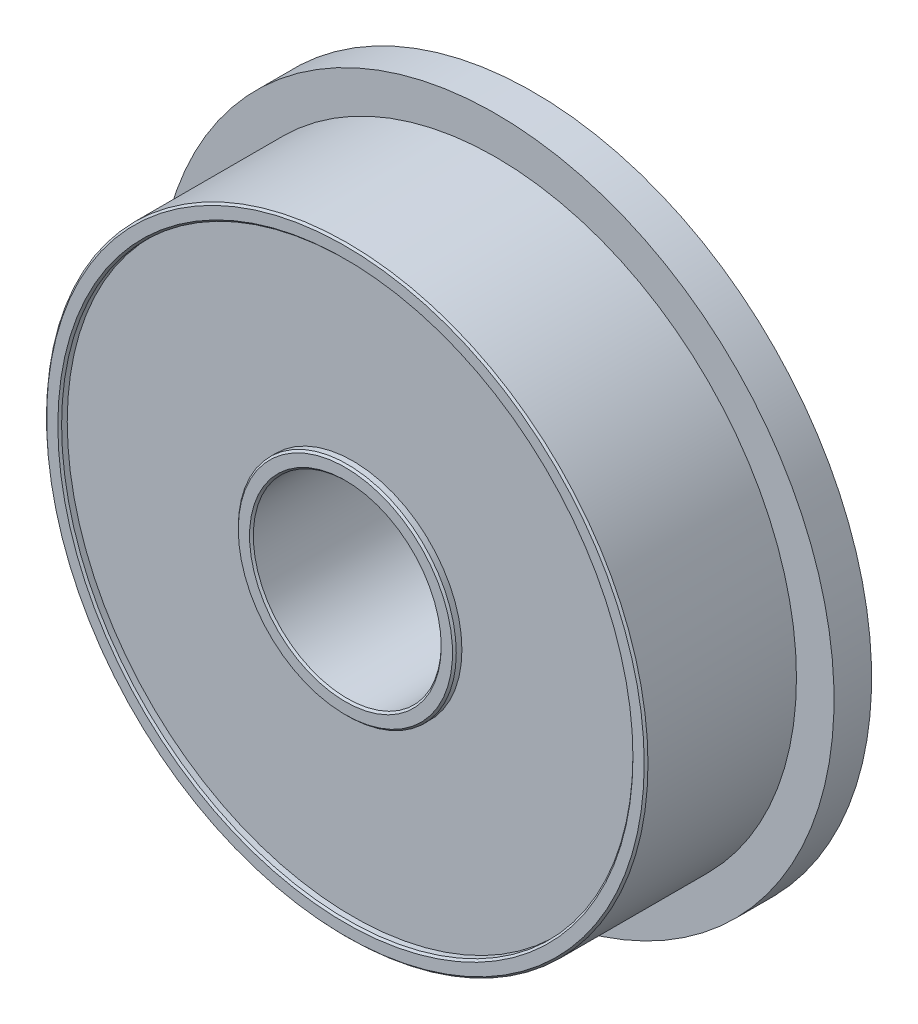
ISO-10303-21;
HEADER;
FILE_DESCRIPTION(('STEP AP214'),'2;1');
FILE_NAME('part.step','',(''),(''),'','','');
FILE_SCHEMA(('AUTOMOTIVE_DESIGN { 1 0 10303 214 1 1 1 1 }'));
ENDSEC;
DATA;
#1=APPLICATION_CONTEXT('core data for automotive mechanical design processes');
#2=APPLICATION_PROTOCOL_DEFINITION('international standard','automotive_design',2000,#1);
#3=PRODUCT_CONTEXT('',#1,'mechanical');
#4=PRODUCT('Part','Part','',(#3));
#5=PRODUCT_RELATED_PRODUCT_CATEGORY('part','',(#4));
#6=PRODUCT_DEFINITION_FORMATION('','',#4);
#7=PRODUCT_DEFINITION_CONTEXT('part definition',#1,'design');
#8=PRODUCT_DEFINITION('design','',#6,#7);
#9=PRODUCT_DEFINITION_SHAPE('','',#8);
#10=(LENGTH_UNIT() NAMED_UNIT(*) SI_UNIT(.MILLI.,.METRE.));
#11=(NAMED_UNIT(*) PLANE_ANGLE_UNIT() SI_UNIT($,.RADIAN.));
#12=(NAMED_UNIT(*) SI_UNIT($,.STERADIAN.) SOLID_ANGLE_UNIT());
#13=UNCERTAINTY_MEASURE_WITH_UNIT(LENGTH_MEASURE(1.E-05),#10,'distance_accuracy_value','');
#14=(GEOMETRIC_REPRESENTATION_CONTEXT(3) GLOBAL_UNCERTAINTY_ASSIGNED_CONTEXT((#13)) GLOBAL_UNIT_ASSIGNED_CONTEXT((#10,
#11,#12)) REPRESENTATION_CONTEXT('',''));
#15=CARTESIAN_POINT('',(0.,0.,0.));
#16=DIRECTION('',(0.,0.,1.));
#17=DIRECTION('',(1.,0.,0.));
#18=AXIS2_PLACEMENT_3D('',#15,#16,#17);
#19=CARTESIAN_POINT('',(0.,0.,-2.5));
#20=DIRECTION('',(0.,0.,1.));
#21=DIRECTION('',(1.,0.,0.));
#22=AXIS2_PLACEMENT_3D('',#19,#20,#21);
#23=PLANE('',#22);
#24=CARTESIAN_POINT('',(0.,0.,-2.5));
#25=DIRECTION('',(0.,0.,1.));
#26=DIRECTION('',(1.,0.,0.));
#27=AXIS2_PLACEMENT_3D('',#24,#25,#26);
#28=CIRCLE('',#27,7.65);
#29=CARTESIAN_POINT('',(7.65,0.,-2.5));
#30=VERTEX_POINT('',#29);
#31=EDGE_CURVE('E39',#30,#30,#28,.T.);
#32=ORIENTED_EDGE('',*,*,#31,.T.);
#33=EDGE_LOOP('',(#32));
#34=FACE_BOUND('',#33,.T.);
#35=CARTESIAN_POINT('',(0.,0.,-2.5));
#36=DIRECTION('',(0.,0.,-1.));
#37=DIRECTION('',(-1.,0.,0.));
#38=AXIS2_PLACEMENT_3D('',#35,#36,#37);
#39=CIRCLE('',#38,9.);
#40=CARTESIAN_POINT('',(-9.,0.,-2.5));
#41=VERTEX_POINT('',#40);
#42=EDGE_CURVE('E86',#41,#41,#39,.T.);
#43=ORIENTED_EDGE('',*,*,#42,.T.);
#44=EDGE_LOOP('',(#43));
#45=FACE_BOUND('',#44,.T.);
#46=ADVANCED_FACE('F32',(#34,#45),#23,.F.);
#47=CARTESIAN_POINT('',(0.,0.,2.5));
#48=DIRECTION('',(0.,0.,1.));
#49=DIRECTION('',(1.,0.,0.));
#50=AXIS2_PLACEMENT_3D('',#47,#48,#49);
#51=PLANE('',#50);
#52=CARTESIAN_POINT('',(0.,0.,2.5));
#53=DIRECTION('',(0.,0.,1.));
#54=DIRECTION('',(1.,0.,0.));
#55=AXIS2_PLACEMENT_3D('',#52,#53,#54);
#56=CIRCLE('',#55,2.85);
#57=CARTESIAN_POINT('',(-2.85,0.,2.5));
#58=VERTEX_POINT('',#57);
#59=EDGE_CURVE('E61',#58,#58,#56,.T.);
#60=ORIENTED_EDGE('',*,*,#59,.T.);
#61=EDGE_LOOP('',(#60));
#62=FACE_BOUND('',#61,.T.);
#63=CARTESIAN_POINT('',(0.,0.,2.5));
#64=DIRECTION('',(0.,0.,1.));
#65=DIRECTION('',(1.,0.,0.));
#66=AXIS2_PLACEMENT_3D('',#63,#64,#65);
#67=CIRCLE('',#66,2.55);
#68=CARTESIAN_POINT('',(2.55,0.,2.5));
#69=VERTEX_POINT('',#68);
#70=EDGE_CURVE('E64',#69,#69,#67,.F.);
#71=ORIENTED_EDGE('',*,*,#70,.T.);
#72=EDGE_LOOP('',(#71));
#73=FACE_BOUND('',#72,.T.);
#74=ADVANCED_FACE('F122',(#62,#73),#51,.T.);
#75=CARTESIAN_POINT('',(0.,0.,2.5));
#76=DIRECTION('',(0.,0.,-1.));
#77=DIRECTION('',(-1.,0.,0.));
#78=AXIS2_PLACEMENT_3D('',#75,#76,#77);
#79=CYLINDRICAL_SURFACE('',#78,8.);
#80=CARTESIAN_POINT('',(0.,0.,2.45));
#81=DIRECTION('',(0.,0.,1.));
#82=DIRECTION('',(1.,0.,0.));
#83=AXIS2_PLACEMENT_3D('',#80,#81,#82);
#84=CIRCLE('',#83,8.);
#85=CARTESIAN_POINT('',(8.,0.,2.45));
#86=VERTEX_POINT('',#85);
#87=EDGE_CURVE('E47',#86,#86,#84,.F.);
#88=ORIENTED_EDGE('',*,*,#87,.T.);
#89=EDGE_LOOP('',(#88));
#90=FACE_BOUND('',#89,.T.);
#91=CARTESIAN_POINT('',(0.,0.,-1.5));
#92=DIRECTION('',(0.,0.,-1.));
#93=DIRECTION('',(-1.,0.,0.));
#94=AXIS2_PLACEMENT_3D('',#91,#92,#93);
#95=CIRCLE('',#94,8.);
#96=CARTESIAN_POINT('',(-8.,0.,-1.5));
#97=VERTEX_POINT('',#96);
#98=EDGE_CURVE('E82',#97,#97,#95,.T.);
#99=ORIENTED_EDGE('',*,*,#98,.F.);
#100=EDGE_LOOP('',(#99));
#101=FACE_BOUND('',#100,.T.);
#102=ADVANCED_FACE('F128',(#90,#101),#79,.T.);
#103=CARTESIAN_POINT('',(0.,0.,2.5));
#104=DIRECTION('',(0.,0.,1.));
#105=DIRECTION('',(1.,0.,0.));
#106=AXIS2_PLACEMENT_3D('',#103,#104,#105);
#107=CIRCLE('',#106,7.95);
#108=CARTESIAN_POINT('',(7.95,0.,2.5));
#109=VERTEX_POINT('',#108);
#110=EDGE_CURVE('E52',#109,#109,#107,.T.);
#111=ORIENTED_EDGE('',*,*,#110,.T.);
#112=EDGE_LOOP('',(#111));
#113=FACE_BOUND('',#112,.T.);
#114=CARTESIAN_POINT('',(0.,0.,2.5));
#115=DIRECTION('',(0.,0.,1.));
#116=DIRECTION('',(1.,0.,0.));
#117=AXIS2_PLACEMENT_3D('',#114,#115,#116);
#118=CIRCLE('',#117,7.65);
#119=CARTESIAN_POINT('',(7.65,0.,2.5));
#120=VERTEX_POINT('',#119);
#121=EDGE_CURVE('E55',#120,#120,#118,.F.);
#122=ORIENTED_EDGE('',*,*,#121,.T.);
#123=EDGE_LOOP('',(#122));
#124=FACE_BOUND('',#123,.T.);
#125=ADVANCED_FACE('F131',(#113,#124),#51,.T.);
#126=CARTESIAN_POINT('',(0.,0.,-2.5));
#127=DIRECTION('',(0.,0.,1.));
#128=DIRECTION('',(1.,0.,0.));
#129=AXIS2_PLACEMENT_3D('',#126,#127,#128);
#130=CIRCLE('',#129,2.55);
#131=CARTESIAN_POINT('',(2.55,0.,-2.5));
#132=VERTEX_POINT('',#131);
#133=EDGE_CURVE('E76',#132,#132,#130,.T.);
#134=ORIENTED_EDGE('',*,*,#133,.T.);
#135=EDGE_LOOP('',(#134));
#136=FACE_BOUND('',#135,.T.);
#137=CARTESIAN_POINT('',(0.,0.,-2.5));
#138=DIRECTION('',(0.,0.,1.));
#139=DIRECTION('',(1.,0.,0.));
#140=AXIS2_PLACEMENT_3D('',#137,#138,#139);
#141=CIRCLE('',#140,2.85);
#142=CARTESIAN_POINT('',(2.85,0.,-2.5));
#143=VERTEX_POINT('',#142);
#144=EDGE_CURVE('E79',#143,#143,#141,.F.);
#145=ORIENTED_EDGE('',*,*,#144,.T.);
#146=EDGE_LOOP('',(#145));
#147=FACE_BOUND('',#146,.T.);
#148=ADVANCED_FACE('F124',(#136,#147),#23,.F.);
#149=CARTESIAN_POINT('',(0.,0.,2.5));
#150=DIRECTION('',(0.,0.,-1.));
#151=DIRECTION('',(-1.,0.,0.));
#152=AXIS2_PLACEMENT_3D('',#149,#150,#151);
#153=CYLINDRICAL_SURFACE('',#152,2.5);
#154=CARTESIAN_POINT('',(0.,0.,-2.45));
#155=DIRECTION('',(0.,0.,1.));
#156=DIRECTION('',(1.,0.,0.));
#157=AXIS2_PLACEMENT_3D('',#154,#155,#156);
#158=CIRCLE('',#157,2.5);
#159=CARTESIAN_POINT('',(2.5,0.,-2.45));
#160=VERTEX_POINT('',#159);
#161=EDGE_CURVE('E70',#160,#160,#158,.F.);
#162=ORIENTED_EDGE('',*,*,#161,.T.);
#163=EDGE_LOOP('',(#162));
#164=FACE_BOUND('',#163,.T.);
#165=CARTESIAN_POINT('',(0.,0.,2.45));
#166=DIRECTION('',(0.,0.,1.));
#167=DIRECTION('',(1.,0.,0.));
#168=AXIS2_PLACEMENT_3D('',#165,#166,#167);
#169=CIRCLE('',#168,2.5);
#170=CARTESIAN_POINT('',(2.5,0.,2.45));
#171=VERTEX_POINT('',#170);
#172=EDGE_CURVE('E73',#171,#171,#169,.T.);
#173=ORIENTED_EDGE('',*,*,#172,.T.);
#174=EDGE_LOOP('',(#173));
#175=FACE_BOUND('',#174,.T.);
#176=ADVANCED_FACE('F135',(#164,#175),#153,.F.);
#177=CARTESIAN_POINT('',(0.,0.,-1.5));
#178=DIRECTION('',(0.,0.,-1.));
#179=DIRECTION('',(-1.,0.,0.));
#180=AXIS2_PLACEMENT_3D('',#177,#178,#179);
#181=PLANE('',#180);
#182=CARTESIAN_POINT('',(0.,0.,-1.5));
#183=DIRECTION('',(0.,0.,-1.));
#184=DIRECTION('',(-1.,0.,0.));
#185=AXIS2_PLACEMENT_3D('',#182,#183,#184);
#186=CIRCLE('',#185,9.);
#187=CARTESIAN_POINT('',(-9.,0.,-1.5));
#188=VERTEX_POINT('',#187);
#189=EDGE_CURVE('E85',#188,#188,#186,.T.);
#190=ORIENTED_EDGE('',*,*,#189,.F.);
#191=EDGE_LOOP('',(#190));
#192=FACE_BOUND('',#191,.T.);
#193=ORIENTED_EDGE('',*,*,#98,.T.);
#194=EDGE_LOOP('',(#193));
#195=FACE_BOUND('',#194,.T.);
#196=ADVANCED_FACE('F141',(#192,#195),#181,.F.);
#197=CARTESIAN_POINT('',(0.,0.,-1.5));
#198=DIRECTION('',(0.,0.,-1.));
#199=DIRECTION('',(-1.,0.,0.));
#200=AXIS2_PLACEMENT_3D('',#197,#198,#199);
#201=CYLINDRICAL_SURFACE('',#200,9.);
#202=ORIENTED_EDGE('',*,*,#189,.T.);
#203=EDGE_LOOP('',(#202));
#204=FACE_BOUND('',#203,.T.);
#205=ORIENTED_EDGE('',*,*,#42,.F.);
#206=EDGE_LOOP('',(#205));
#207=FACE_BOUND('',#206,.T.);
#208=ADVANCED_FACE('F182',(#204,#207),#201,.T.);
#209=CARTESIAN_POINT('',(0.,0.,2.3));
#210=DIRECTION('',(0.,0.,1.));
#211=DIRECTION('',(1.,0.,0.));
#212=AXIS2_PLACEMENT_3D('',#209,#210,#211);
#213=CYLINDRICAL_SURFACE('',#212,7.6);
#214=CARTESIAN_POINT('',(0.,0.,2.44999999999999));
#215=DIRECTION('',(0.,0.,1.));
#216=DIRECTION('',(1.,0.,0.));
#217=AXIS2_PLACEMENT_3D('',#214,#215,#216);
#218=CIRCLE('',#217,7.6);
#219=CARTESIAN_POINT('',(7.6,0.,2.44999999999999));
#220=VERTEX_POINT('',#219);
#221=EDGE_CURVE('E43',#220,#220,#218,.T.);
#222=ORIENTED_EDGE('',*,*,#221,.T.);
#223=EDGE_LOOP('',(#222));
#224=FACE_BOUND('',#223,.T.);
#225=CARTESIAN_POINT('',(0.,0.,2.3));
#226=DIRECTION('',(0.,0.,1.));
#227=DIRECTION('',(1.,0.,0.));
#228=AXIS2_PLACEMENT_3D('',#225,#226,#227);
#229=CIRCLE('',#228,7.6);
#230=CARTESIAN_POINT('',(7.6,0.,2.3));
#231=VERTEX_POINT('',#230);
#232=EDGE_CURVE('E89',#231,#231,#229,.T.);
#233=ORIENTED_EDGE('',*,*,#232,.F.);
#234=EDGE_LOOP('',(#233));
#235=FACE_BOUND('',#234,.T.);
#236=ADVANCED_FACE('F178',(#224,#235),#213,.F.);
#237=CARTESIAN_POINT('',(0.,0.,2.3));
#238=DIRECTION('',(0.,0.,1.));
#239=DIRECTION('',(1.,0.,0.));
#240=AXIS2_PLACEMENT_3D('',#237,#238,#239);
#241=PLANE('',#240);
#242=CARTESIAN_POINT('',(0.,0.,2.3));
#243=DIRECTION('',(0.,0.,1.));
#244=DIRECTION('',(1.,0.,0.));
#245=AXIS2_PLACEMENT_3D('',#242,#243,#244);
#246=CIRCLE('',#245,2.9);
#247=CARTESIAN_POINT('',(2.9,0.,2.3));
#248=VERTEX_POINT('',#247);
#249=EDGE_CURVE('E94',#248,#248,#246,.T.);
#250=ORIENTED_EDGE('',*,*,#249,.F.);
#251=EDGE_LOOP('',(#250));
#252=FACE_BOUND('',#251,.T.);
#253=ORIENTED_EDGE('',*,*,#232,.T.);
#254=EDGE_LOOP('',(#253));
#255=FACE_BOUND('',#254,.T.);
#256=ADVANCED_FACE('F181',(#252,#255),#241,.T.);
#257=CARTESIAN_POINT('',(0.,0.,2.3));
#258=DIRECTION('',(0.,0.,1.));
#259=DIRECTION('',(1.,0.,0.));
#260=AXIS2_PLACEMENT_3D('',#257,#258,#259);
#261=CYLINDRICAL_SURFACE('',#260,2.9);
#262=CARTESIAN_POINT('',(0.,0.,2.45));
#263=DIRECTION('',(0.,0.,1.));
#264=DIRECTION('',(1.,0.,0.));
#265=AXIS2_PLACEMENT_3D('',#262,#263,#264);
#266=CIRCLE('',#265,2.9);
#267=CARTESIAN_POINT('',(-2.9,0.,2.45));
#268=VERTEX_POINT('',#267);
#269=EDGE_CURVE('E58',#268,#268,#266,.F.);
#270=ORIENTED_EDGE('',*,*,#269,.T.);
#271=EDGE_LOOP('',(#270));
#272=FACE_BOUND('',#271,.T.);
#273=ORIENTED_EDGE('',*,*,#249,.T.);
#274=EDGE_LOOP('',(#273));
#275=FACE_BOUND('',#274,.T.);
#276=ADVANCED_FACE('F187',(#272,#275),#261,.T.);
#277=CARTESIAN_POINT('',(0.,0.,-2.3));
#278=DIRECTION('',(0.,0.,-1.));
#279=DIRECTION('',(1.,0.,0.));
#280=AXIS2_PLACEMENT_3D('',#277,#278,#279);
#281=PLANE('',#280);
#282=CARTESIAN_POINT('',(0.,0.,-2.3));
#283=DIRECTION('',(0.,0.,1.));
#284=DIRECTION('',(1.,0.,0.));
#285=AXIS2_PLACEMENT_3D('',#282,#283,#284);
#286=CIRCLE('',#285,7.6);
#287=CARTESIAN_POINT('',(7.6,0.,-2.3));
#288=VERTEX_POINT('',#287);
#289=EDGE_CURVE('E97',#288,#288,#286,.T.);
#290=ORIENTED_EDGE('',*,*,#289,.F.);
#291=EDGE_LOOP('',(#290));
#292=FACE_BOUND('',#291,.T.);
#293=CARTESIAN_POINT('',(0.,0.,-2.3));
#294=DIRECTION('',(0.,0.,1.));
#295=DIRECTION('',(1.,0.,0.));
#296=AXIS2_PLACEMENT_3D('',#293,#294,#295);
#297=CIRCLE('',#296,2.9);
#298=CARTESIAN_POINT('',(2.9,0.,-2.3));
#299=VERTEX_POINT('',#298);
#300=EDGE_CURVE('E100',#299,#299,#297,.T.);
#301=ORIENTED_EDGE('',*,*,#300,.T.);
#302=EDGE_LOOP('',(#301));
#303=FACE_BOUND('',#302,.T.);
#304=ADVANCED_FACE('F104',(#292,#303),#281,.T.);
#305=CARTESIAN_POINT('',(0.,0.,-2.3));
#306=DIRECTION('',(0.,0.,-1.));
#307=DIRECTION('',(-1.,0.,0.));
#308=AXIS2_PLACEMENT_3D('',#305,#306,#307);
#309=CYLINDRICAL_SURFACE('',#308,7.6);
#310=CARTESIAN_POINT('',(0.,0.,-2.45));
#311=DIRECTION('',(0.,0.,1.));
#312=DIRECTION('',(1.,0.,0.));
#313=AXIS2_PLACEMENT_3D('',#310,#311,#312);
#314=CIRCLE('',#313,7.6);
#315=CARTESIAN_POINT('',(7.6,0.,-2.45));
#316=VERTEX_POINT('',#315);
#317=EDGE_CURVE('E10',#316,#316,#314,.F.);
#318=ORIENTED_EDGE('',*,*,#317,.T.);
#319=EDGE_LOOP('',(#318));
#320=FACE_BOUND('',#319,.T.);
#321=ORIENTED_EDGE('',*,*,#289,.T.);
#322=EDGE_LOOP('',(#321));
#323=FACE_BOUND('',#322,.T.);
#324=ADVANCED_FACE('F109',(#320,#323),#309,.F.);
#325=CARTESIAN_POINT('',(0.,0.,-2.3));
#326=DIRECTION('',(0.,0.,-1.));
#327=DIRECTION('',(-1.,0.,0.));
#328=AXIS2_PLACEMENT_3D('',#325,#326,#327);
#329=CYLINDRICAL_SURFACE('',#328,2.9);
#330=CARTESIAN_POINT('',(0.,0.,-2.45));
#331=DIRECTION('',(0.,0.,1.));
#332=DIRECTION('',(1.,0.,0.));
#333=AXIS2_PLACEMENT_3D('',#330,#331,#332);
#334=CIRCLE('',#333,2.9);
#335=CARTESIAN_POINT('',(2.9,0.,-2.45));
#336=VERTEX_POINT('',#335);
#337=EDGE_CURVE('E67',#336,#336,#334,.T.);
#338=ORIENTED_EDGE('',*,*,#337,.T.);
#339=EDGE_LOOP('',(#338));
#340=FACE_BOUND('',#339,.T.);
#341=ORIENTED_EDGE('',*,*,#300,.F.);
#342=EDGE_LOOP('',(#341));
#343=FACE_BOUND('',#342,.T.);
#344=ADVANCED_FACE('F106',(#340,#343),#329,.T.);
#345=CARTESIAN_POINT('',(0.,0.,-2.5));
#346=DIRECTION('',(0.,0.,-1.));
#347=DIRECTION('',(-1.,0.,0.));
#348=AXIS2_PLACEMENT_3D('',#345,#346,#347);
#349=CONICAL_SURFACE('',#348,2.55,0.785398163397427);
#350=ORIENTED_EDGE('',*,*,#161,.F.);
#351=EDGE_LOOP('',(#350));
#352=FACE_BOUND('',#351,.T.);
#353=ORIENTED_EDGE('',*,*,#133,.F.);
#354=EDGE_LOOP('',(#353));
#355=FACE_BOUND('',#354,.T.);
#356=ADVANCED_FACE('F108',(#352,#355),#349,.F.);
#357=CARTESIAN_POINT('',(0.,0.,-2.45));
#358=DIRECTION('',(0.,0.,1.));
#359=DIRECTION('',(1.,0.,0.));
#360=AXIS2_PLACEMENT_3D('',#357,#358,#359);
#361=CONICAL_SURFACE('',#360,2.9,0.785398163397435);
#362=ORIENTED_EDGE('',*,*,#144,.F.);
#363=EDGE_LOOP('',(#362));
#364=FACE_BOUND('',#363,.T.);
#365=ORIENTED_EDGE('',*,*,#337,.F.);
#366=EDGE_LOOP('',(#365));
#367=FACE_BOUND('',#366,.T.);
#368=ADVANCED_FACE('F116',(#364,#367),#361,.T.);
#369=CARTESIAN_POINT('',(0.,0.,2.5));
#370=DIRECTION('',(0.,0.,-1.));
#371=DIRECTION('',(-1.,0.,0.));
#372=AXIS2_PLACEMENT_3D('',#369,#370,#371);
#373=CONICAL_SURFACE('',#372,2.85,0.785398163397444);
#374=CARTESIAN_POINT('',(-2.9,0.,2.45));
#375=CARTESIAN_POINT('',(-2.89947916666667,0.,2.45052083333333));
#376=CARTESIAN_POINT('',(-2.89895833333333,0.,2.45104166666667));
#377=CARTESIAN_POINT('',(-2.89791666666667,0.,2.45208333333333));
#378=CARTESIAN_POINT('',(-2.89739583333333,0.,2.45260416666667));
#379=CARTESIAN_POINT('',(-2.89635416666667,0.,2.45364583333333));
#380=CARTESIAN_POINT('',(-2.89583333333333,0.,2.45416666666667));
#381=CARTESIAN_POINT('',(-2.89479166666667,0.,2.45520833333333));
#382=CARTESIAN_POINT('',(-2.89427083333333,0.,2.45572916666667));
#383=CARTESIAN_POINT('',(-2.89322916666667,0.,2.45677083333333));
#384=CARTESIAN_POINT('',(-2.89270833333333,0.,2.45729166666667));
#385=CARTESIAN_POINT('',(-2.89166666666667,0.,2.45833333333333));
#386=CARTESIAN_POINT('',(-2.89114583333333,0.,2.45885416666667));
#387=CARTESIAN_POINT('',(-2.89010416666667,0.,2.45989583333333));
#388=CARTESIAN_POINT('',(-2.88958333333333,0.,2.46041666666667));
#389=CARTESIAN_POINT('',(-2.88854166666667,0.,2.46145833333333));
#390=CARTESIAN_POINT('',(-2.88802083333333,0.,2.46197916666667));
#391=CARTESIAN_POINT('',(-2.88697916666667,0.,2.46302083333333));
#392=CARTESIAN_POINT('',(-2.88645833333333,0.,2.46354166666667));
#393=CARTESIAN_POINT('',(-2.88541666666667,0.,2.46458333333333));
#394=CARTESIAN_POINT('',(-2.88489583333333,0.,2.46510416666667));
#395=CARTESIAN_POINT('',(-2.88385416666667,0.,2.46614583333333));
#396=CARTESIAN_POINT('',(-2.88333333333333,0.,2.46666666666667));
#397=CARTESIAN_POINT('',(-2.88229166666667,0.,2.46770833333333));
#398=CARTESIAN_POINT('',(-2.88177083333333,0.,2.46822916666667));
#399=CARTESIAN_POINT('',(-2.88072916666667,0.,2.46927083333333));
#400=CARTESIAN_POINT('',(-2.88020833333333,0.,2.46979166666667));
#401=CARTESIAN_POINT('',(-2.87916666666667,0.,2.47083333333333));
#402=CARTESIAN_POINT('',(-2.87864583333333,0.,2.47135416666667));
#403=CARTESIAN_POINT('',(-2.87760416666667,0.,2.47239583333333));
#404=CARTESIAN_POINT('',(-2.87708333333333,0.,2.47291666666667));
#405=CARTESIAN_POINT('',(-2.87604166666667,0.,2.47395833333333));
#406=CARTESIAN_POINT('',(-2.87552083333334,0.,2.47447916666667));
#407=CARTESIAN_POINT('',(-2.87447916666667,0.,2.47552083333333));
#408=CARTESIAN_POINT('',(-2.87395833333333,0.,2.47604166666667));
#409=CARTESIAN_POINT('',(-2.87291666666667,0.,2.47708333333333));
#410=CARTESIAN_POINT('',(-2.87239583333333,0.,2.47760416666667));
#411=CARTESIAN_POINT('',(-2.87135416666667,0.,2.47864583333333));
#412=CARTESIAN_POINT('',(-2.87083333333333,0.,2.47916666666667));
#413=CARTESIAN_POINT('',(-2.86979166666667,0.,2.48020833333333));
#414=CARTESIAN_POINT('',(-2.86927083333334,0.,2.48072916666667));
#415=CARTESIAN_POINT('',(-2.86822916666667,0.,2.48177083333333));
#416=CARTESIAN_POINT('',(-2.86770833333334,0.,2.48229166666667));
#417=CARTESIAN_POINT('',(-2.86666666666667,0.,2.48333333333333));
#418=CARTESIAN_POINT('',(-2.86614583333334,0.,2.48385416666667));
#419=CARTESIAN_POINT('',(-2.86510416666667,0.,2.48489583333333));
#420=CARTESIAN_POINT('',(-2.86458333333334,0.,2.48541666666667));
#421=CARTESIAN_POINT('',(-2.86354166666667,0.,2.48645833333333));
#422=CARTESIAN_POINT('',(-2.86302083333334,0.,2.48697916666667));
#423=CARTESIAN_POINT('',(-2.86197916666667,0.,2.48802083333333));
#424=CARTESIAN_POINT('',(-2.86145833333333,0.,2.48854166666667));
#425=CARTESIAN_POINT('',(-2.86041666666667,0.,2.48958333333333));
#426=CARTESIAN_POINT('',(-2.85989583333334,0.,2.49010416666667));
#427=CARTESIAN_POINT('',(-2.85885416666667,0.,2.49114583333333));
#428=CARTESIAN_POINT('',(-2.85833333333334,0.,2.49166666666667));
#429=CARTESIAN_POINT('',(-2.85729166666667,0.,2.49270833333333));
#430=CARTESIAN_POINT('',(-2.85677083333334,0.,2.49322916666667));
#431=CARTESIAN_POINT('',(-2.85572916666667,0.,2.49427083333333));
#432=CARTESIAN_POINT('',(-2.85520833333334,0.,2.49479166666667));
#433=CARTESIAN_POINT('',(-2.85416666666667,0.,2.49583333333333));
#434=CARTESIAN_POINT('',(-2.85364583333334,0.,2.49635416666667));
#435=CARTESIAN_POINT('',(-2.85260416666667,0.,2.49739583333333));
#436=CARTESIAN_POINT('',(-2.85208333333334,0.,2.49791666666667));
#437=CARTESIAN_POINT('',(-2.85104166666667,0.,2.49895833333333));
#438=CARTESIAN_POINT('',(-2.85052083333334,0.,2.49947916666667));
#439=CARTESIAN_POINT('',(-2.85,0.,2.5));
#440=B_SPLINE_CURVE_WITH_KNOTS('',3,(#374,#375,#376,#377,#378,#379,#380,#381,#382,#383,#384,
#385,#386,#387,#388,#389,#390,#391,#392,#393,#394,#395,#396,#397,#398,#399,#400,#401,#402,#403,
#404,#405,#406,#407,#408,#409,#410,#411,#412,#413,#414,#415,#416,#417,#418,#419,#420,#421,#422,
#423,#424,#425,#426,#427,#428,#429,#430,#431,#432,#433,#434,#435,#436,#437,#438,#439),
.UNSPECIFIED.,.F.,.F.,(4,2,2,2,2,2,2,2,2,2,2,2,2,2,2,2,2,2,2,2,2,2,2,2,2,2,2,2,2,2,2,2,4),(0.,
0.00220970869120833,0.00441941738241605,0.00662912607362377,0.00883883476483179,
0.0110485434560398,0.0132582521472475,0.0154679608384552,0.0176776695296633,0.0198873782208713,
0.022097086912079,0.024306795603287,0.0265165042944948,0.0287262129857028,0.0309359216769105,
0.0331456303681185,0.0353553390593262,0.0375650477505343,0.0397747564417423,0.04198446513295,
0.0441941738241577,0.0464038825153658,0.0486135912065738,0.0508232998977815,0.0530330085889892,
0.0552427172801976,0.0574524259714053,0.059662134662613,0.061871843353821,0.064081552045029,
0.0662912607362368,0.0685009694274445,0.0707106781186528),.UNSPECIFIED.);
#441=EDGE_CURVE('BSEAM151',#268,#58,#440,.T.);
#442=ORIENTED_EDGE('',*,*,#269,.F.);
#443=ORIENTED_EDGE('',*,*,#59,.F.);
#444=ORIENTED_EDGE('',*,*,#441,.T.);
#445=ORIENTED_EDGE('',*,*,#441,.F.);
#446=EDGE_LOOP('',(#442,#444,#443,#445));
#447=FACE_BOUND('',#446,.T.);
#448=ADVANCED_FACE('F151',(#447),#373,.T.);
#449=CARTESIAN_POINT('',(0.,0.,2.45));
#450=DIRECTION('',(0.,0.,1.));
#451=DIRECTION('',(1.,0.,0.));
#452=AXIS2_PLACEMENT_3D('',#449,#450,#451);
#453=CONICAL_SURFACE('',#452,2.5,0.785398163397431);
#454=ORIENTED_EDGE('',*,*,#70,.F.);
#455=EDGE_LOOP('',(#454));
#456=FACE_BOUND('',#455,.T.);
#457=ORIENTED_EDGE('',*,*,#172,.F.);
#458=EDGE_LOOP('',(#457));
#459=FACE_BOUND('',#458,.T.);
#460=ADVANCED_FACE('F157',(#456,#459),#453,.F.);
#461=CARTESIAN_POINT('',(0.,0.,2.5));
#462=DIRECTION('',(0.,0.,-1.));
#463=DIRECTION('',(-1.,0.,0.));
#464=AXIS2_PLACEMENT_3D('',#461,#462,#463);
#465=CONICAL_SURFACE('',#464,7.95,0.785398163397448);
#466=ORIENTED_EDGE('',*,*,#87,.F.);
#467=EDGE_LOOP('',(#466));
#468=FACE_BOUND('',#467,.T.);
#469=ORIENTED_EDGE('',*,*,#110,.F.);
#470=EDGE_LOOP('',(#469));
#471=FACE_BOUND('',#470,.T.);
#472=ADVANCED_FACE('F163',(#468,#471),#465,.T.);
#473=CARTESIAN_POINT('',(0.,0.,2.44999999999999));
#474=DIRECTION('',(0.,0.,1.));
#475=DIRECTION('',(1.,0.,0.));
#476=AXIS2_PLACEMENT_3D('',#473,#474,#475);
#477=CONICAL_SURFACE('',#476,7.6,0.785398163397422);
#478=CARTESIAN_POINT('',(7.65,0.,2.5));
#479=CARTESIAN_POINT('',(7.64947916666667,0.,2.49947916666667));
#480=CARTESIAN_POINT('',(7.64895833333334,0.,2.49895833333333));
#481=CARTESIAN_POINT('',(7.64791666666667,0.,2.49791666666667));
#482=CARTESIAN_POINT('',(7.64739583333334,0.,2.49739583333333));
#483=CARTESIAN_POINT('',(7.64635416666667,0.,2.49635416666667));
#484=CARTESIAN_POINT('',(7.64583333333334,0.,2.49583333333333));
#485=CARTESIAN_POINT('',(7.64479166666667,0.,2.49479166666667));
#486=CARTESIAN_POINT('',(7.64427083333334,0.,2.49427083333333));
#487=CARTESIAN_POINT('',(7.64322916666667,0.,2.49322916666667));
#488=CARTESIAN_POINT('',(7.64270833333334,0.,2.49270833333333));
#489=CARTESIAN_POINT('',(7.64166666666667,0.,2.49166666666667));
#490=CARTESIAN_POINT('',(7.64114583333334,0.,2.49114583333333));
#491=CARTESIAN_POINT('',(7.64010416666667,0.,2.49010416666667));
#492=CARTESIAN_POINT('',(7.63958333333334,0.,2.48958333333333));
#493=CARTESIAN_POINT('',(7.63854166666667,0.,2.48854166666667));
#494=CARTESIAN_POINT('',(7.63802083333334,0.,2.48802083333333));
#495=CARTESIAN_POINT('',(7.63697916666667,0.,2.48697916666667));
#496=CARTESIAN_POINT('',(7.63645833333334,0.,2.48645833333333));
#497=CARTESIAN_POINT('',(7.63541666666667,0.,2.48541666666666));
#498=CARTESIAN_POINT('',(7.63489583333334,0.,2.48489583333333));
#499=CARTESIAN_POINT('',(7.63385416666667,0.,2.48385416666666));
#500=CARTESIAN_POINT('',(7.63333333333334,0.,2.48333333333333));
#501=CARTESIAN_POINT('',(7.63229166666667,0.,2.48229166666666));
#502=CARTESIAN_POINT('',(7.63177083333334,0.,2.48177083333333));
#503=CARTESIAN_POINT('',(7.63072916666667,0.,2.48072916666666));
#504=CARTESIAN_POINT('',(7.63020833333333,0.,2.48020833333333));
#505=CARTESIAN_POINT('',(7.62916666666667,0.,2.47916666666666));
#506=CARTESIAN_POINT('',(7.62864583333334,0.,2.47864583333333));
#507=CARTESIAN_POINT('',(7.62760416666667,0.,2.47760416666666));
#508=CARTESIAN_POINT('',(7.62708333333334,0.,2.47708333333333));
#509=CARTESIAN_POINT('',(7.62604166666667,0.,2.47604166666666));
#510=CARTESIAN_POINT('',(7.62552083333333,0.,2.47552083333333));
#511=CARTESIAN_POINT('',(7.62447916666667,0.,2.47447916666666));
#512=CARTESIAN_POINT('',(7.62395833333334,0.,2.47395833333333));
#513=CARTESIAN_POINT('',(7.62291666666667,0.,2.47291666666666));
#514=CARTESIAN_POINT('',(7.62239583333333,0.,2.47239583333333));
#515=CARTESIAN_POINT('',(7.62135416666667,0.,2.47135416666666));
#516=CARTESIAN_POINT('',(7.62083333333333,0.,2.47083333333333));
#517=CARTESIAN_POINT('',(7.61979166666667,0.,2.46979166666666));
#518=CARTESIAN_POINT('',(7.61927083333333,0.,2.46927083333333));
#519=CARTESIAN_POINT('',(7.61822916666667,0.,2.46822916666666));
#520=CARTESIAN_POINT('',(7.61770833333333,0.,2.46770833333333));
#521=CARTESIAN_POINT('',(7.61666666666667,0.,2.46666666666666));
#522=CARTESIAN_POINT('',(7.61614583333333,0.,2.46614583333333));
#523=CARTESIAN_POINT('',(7.61510416666667,0.,2.46510416666666));
#524=CARTESIAN_POINT('',(7.61458333333333,0.,2.46458333333333));
#525=CARTESIAN_POINT('',(7.61354166666667,0.,2.46354166666666));
#526=CARTESIAN_POINT('',(7.61302083333333,0.,2.46302083333333));
#527=CARTESIAN_POINT('',(7.61197916666667,0.,2.46197916666666));
#528=CARTESIAN_POINT('',(7.61145833333333,0.,2.46145833333333));
#529=CARTESIAN_POINT('',(7.61041666666667,0.,2.46041666666666));
#530=CARTESIAN_POINT('',(7.60989583333333,0.,2.45989583333333));
#531=CARTESIAN_POINT('',(7.60885416666667,0.,2.45885416666666));
#532=CARTESIAN_POINT('',(7.60833333333333,0.,2.45833333333333));
#533=CARTESIAN_POINT('',(7.60729166666667,0.,2.45729166666666));
#534=CARTESIAN_POINT('',(7.60677083333333,0.,2.45677083333333));
#535=CARTESIAN_POINT('',(7.60572916666667,0.,2.45572916666666));
#536=CARTESIAN_POINT('',(7.60520833333333,0.,2.45520833333333));
#537=CARTESIAN_POINT('',(7.60416666666667,0.,2.45416666666666));
#538=CARTESIAN_POINT('',(7.60364583333333,0.,2.45364583333333));
#539=CARTESIAN_POINT('',(7.60260416666667,0.,2.45260416666666));
#540=CARTESIAN_POINT('',(7.60208333333333,0.,2.45208333333333));
#541=CARTESIAN_POINT('',(7.60104166666667,0.,2.45104166666666));
#542=CARTESIAN_POINT('',(7.60052083333333,0.,2.45052083333333));
#543=CARTESIAN_POINT('',(7.6,0.,2.44999999999999));
#544=B_SPLINE_CURVE_WITH_KNOTS('',3,(#478,#479,#480,#481,#482,#483,#484,#485,#486,#487,#488,
#489,#490,#491,#492,#493,#494,#495,#496,#497,#498,#499,#500,#501,#502,#503,#504,#505,#506,#507,
#508,#509,#510,#511,#512,#513,#514,#515,#516,#517,#518,#519,#520,#521,#522,#523,#524,#525,#526,
#527,#528,#529,#530,#531,#532,#533,#534,#535,#536,#537,#538,#539,#540,#541,#542,#543),
.UNSPECIFIED.,.F.,.F.,(4,2,2,2,2,2,2,2,2,2,2,2,2,2,2,2,2,2,2,2,2,2,2,2,2,2,2,2,2,2,2,2,4),(0.,
0.00220970869120864,0.00441941738241666,0.00662912607362469,0.00883883476483332,
0.0110485434560413,0.0132582521472494,0.015467960838458,0.0176776695296657,0.0198873782208738,
0.0220970869120824,0.0243067956032904,0.0265165042944984,0.0287262129857071,0.0309359216769151,
0.0331456303681231,0.0353553390593315,0.0375650477505395,0.0397747564417475,0.0419844651329561,
0.0441941738241642,0.0464038825153722,0.0486135912065808,0.0508232998977889,0.0530330085889975,
0.0552427172802052,0.0574524259714132,0.0596621346626219,0.0618718433538299,0.0640815520450379,
0.0662912607362466,0.0685009694274546,0.0707106781186623),.UNSPECIFIED.);
#545=EDGE_CURVE('BSEAM166',#120,#220,#544,.T.);
#546=ORIENTED_EDGE('',*,*,#121,.F.);
#547=ORIENTED_EDGE('',*,*,#221,.F.);
#548=ORIENTED_EDGE('',*,*,#545,.T.);
#549=ORIENTED_EDGE('',*,*,#545,.F.);
#550=EDGE_LOOP('',(#546,#548,#547,#549));
#551=FACE_BOUND('',#550,.T.);
#552=ADVANCED_FACE('F166',(#551),#477,.F.);
#553=CARTESIAN_POINT('',(0.,0.,-2.5));
#554=DIRECTION('',(0.,0.,-1.));
#555=DIRECTION('',(-1.,0.,0.));
#556=AXIS2_PLACEMENT_3D('',#553,#554,#555);
#557=CONICAL_SURFACE('',#556,7.65,0.785398163397431);
#558=ORIENTED_EDGE('',*,*,#317,.F.);
#559=EDGE_LOOP('',(#558));
#560=FACE_BOUND('',#559,.T.);
#561=ORIENTED_EDGE('',*,*,#31,.F.);
#562=EDGE_LOOP('',(#561));
#563=FACE_BOUND('',#562,.T.);
#564=ADVANCED_FACE('F34',(#560,#563),#557,.F.);
#565=CLOSED_SHELL('',(#46,#74,#102,#125,#148,#176,#196,#208,#236,#256,#276,#304,#324,#344,#356,
#368,#448,#460,#472,#552,#564));
#566=MANIFOLD_SOLID_BREP('B2',#565);
#567=ADVANCED_BREP_SHAPE_REPRESENTATION('',(#18,#566),#14);
#568=SHAPE_DEFINITION_REPRESENTATION(#9,#567);
ENDSEC;
END-ISO-10303-21;
